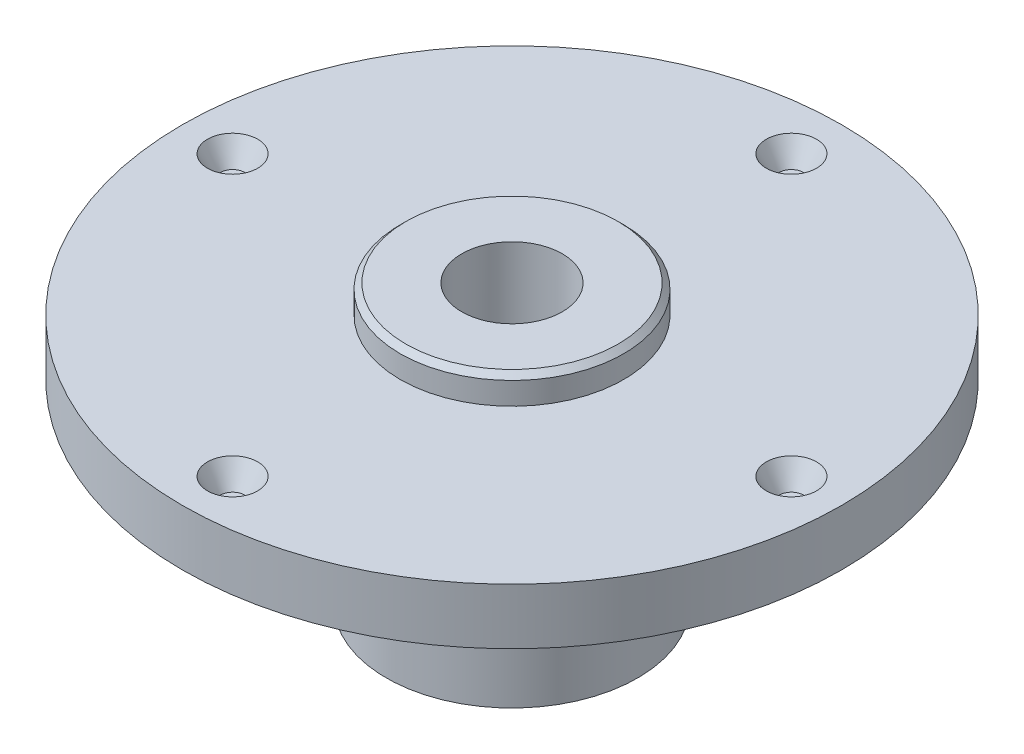
ISO-10303-21;
HEADER;
FILE_DESCRIPTION(('STEP AP214'),'2;1');
FILE_NAME('part.step','',(''),(''),'','','');
FILE_SCHEMA(('AUTOMOTIVE_DESIGN { 1 0 10303 214 1 1 1 1 }'));
ENDSEC;
DATA;
#1=APPLICATION_CONTEXT('core data for automotive mechanical design processes');
#2=APPLICATION_PROTOCOL_DEFINITION('international standard','automotive_design',2000,#1);
#3=PRODUCT_CONTEXT('',#1,'mechanical');
#4=PRODUCT('Part','Part','',(#3));
#5=PRODUCT_RELATED_PRODUCT_CATEGORY('part','',(#4));
#6=PRODUCT_DEFINITION_FORMATION('','',#4);
#7=PRODUCT_DEFINITION_CONTEXT('part definition',#1,'design');
#8=PRODUCT_DEFINITION('design','',#6,#7);
#9=PRODUCT_DEFINITION_SHAPE('','',#8);
#10=(LENGTH_UNIT() NAMED_UNIT(*) SI_UNIT(.MILLI.,.METRE.));
#11=(NAMED_UNIT(*) PLANE_ANGLE_UNIT() SI_UNIT($,.RADIAN.));
#12=(NAMED_UNIT(*) SI_UNIT($,.STERADIAN.) SOLID_ANGLE_UNIT());
#13=UNCERTAINTY_MEASURE_WITH_UNIT(LENGTH_MEASURE(1.E-05),#10,'distance_accuracy_value','');
#14=(GEOMETRIC_REPRESENTATION_CONTEXT(3) GLOBAL_UNCERTAINTY_ASSIGNED_CONTEXT((#13)) GLOBAL_UNIT_ASSIGNED_CONTEXT((#10,
#11,#12)) REPRESENTATION_CONTEXT('',''));
#15=CARTESIAN_POINT('',(0.,0.,0.));
#16=DIRECTION('',(0.,0.,1.));
#17=DIRECTION('',(1.,0.,0.));
#18=AXIS2_PLACEMENT_3D('',#15,#16,#17);
#19=CARTESIAN_POINT('',(0.,0.,0.));
#20=DIRECTION('',(0.,-1.,0.));
#21=DIRECTION('',(0.,0.,-1.));
#22=AXIS2_PLACEMENT_3D('',#19,#20,#21);
#23=CYLINDRICAL_SURFACE('',#22,9.);
#24=CARTESIAN_POINT('',(-8.64580823289529,15.,-2.5));
#25=CARTESIAN_POINT('',(-8.64581037496086,15.1374869532899,-2.49999714996617));
#26=CARTESIAN_POINT('',(-8.64912360937159,15.2750032400731,-2.48861977425243));
#27=CARTESIAN_POINT('',(-8.66197474072458,15.5460485954312,-2.44350693717148));
#28=CARTESIAN_POINT('',(-8.67151541786231,15.6795758552777,-2.40976148964066));
#29=CARTESIAN_POINT('',(-8.69565935423007,15.9386823267595,-2.32112008680785));
#30=CARTESIAN_POINT('',(-8.71025507855494,16.0642730407537,-2.26625559744293));
#31=CARTESIAN_POINT('',(-8.74285475062133,16.3044909220554,-2.13703377417484));
#32=CARTESIAN_POINT('',(-8.76085904445197,16.4191169742854,-2.06267446056935));
#33=CARTESIAN_POINT('',(-8.79879482245345,16.6372618555828,-1.89441531907552));
#34=CARTESIAN_POINT('',(-8.81876275539878,16.7404391176362,-1.80008077870937));
#35=CARTESIAN_POINT('',(-8.85806239814546,16.9297308390393,-1.59548286960028));
#36=CARTESIAN_POINT('',(-8.87739403696071,17.015843399965,-1.48521773095722));
#37=CARTESIAN_POINT('',(-8.91365202741973,17.1700044611612,-1.249500428906));
#38=CARTESIAN_POINT('',(-8.93053038427289,17.2377105918444,-1.12381632761083));
#39=CARTESIAN_POINT('',(-8.95956018312964,17.3508992737597,-0.862300362049424));
#40=CARTESIAN_POINT('',(-8.97171249276934,17.396385904574,-0.726470365890892));
#41=CARTESIAN_POINT('',(-8.98966318340413,17.4627309454726,-0.452086360205861));
#42=CARTESIAN_POINT('',(-8.99561138050702,17.4841710422613,-0.313682975067016));
#43=CARTESIAN_POINT('',(-9.00100867384281,17.503647456656,-0.0351244568787281));
#44=CARTESIAN_POINT('',(-9.00045894674934,17.5016880115567,0.105030354422776));
#45=CARTESIAN_POINT('',(-8.99303086374215,17.4748244476162,0.379054247152544));
#46=CARTESIAN_POINT('',(-8.9863259807526,17.4505492360309,0.512990410045097));
#47=CARTESIAN_POINT('',(-8.96754760099033,17.3807628617674,0.77480748332248));
#48=CARTESIAN_POINT('',(-8.95547378574645,17.3352504393449,0.902688034006089));
#49=CARTESIAN_POINT('',(-8.92706250606229,17.2238179194169,1.15033359179948));
#50=CARTESIAN_POINT('',(-8.91068150784286,17.1576880904757,1.26999902658788));
#51=CARTESIAN_POINT('',(-8.87541221350138,17.0070603841802,1.49674457308826));
#52=CARTESIAN_POINT('',(-8.85652339359456,16.922558667308,1.60382204684013));
#53=CARTESIAN_POINT('',(-8.81753663226074,16.7342713422228,1.8061067603823));
#54=CARTESIAN_POINT('',(-8.79741936953618,16.6299381943543,1.9008012505898));
#55=CARTESIAN_POINT('',(-8.75880383152746,16.4066673248778,2.07148108085113));
#56=CARTESIAN_POINT('',(-8.74030567318146,16.2877285498816,2.14746507027557));
#57=CARTESIAN_POINT('',(-8.70694013940655,16.0374352785877,2.27900238121953));
#58=CARTESIAN_POINT('',(-8.69209980055975,15.9059977306941,2.33440501640979));
#59=CARTESIAN_POINT('',(-8.66806022503139,15.6351564042415,2.42215297643582));
#60=CARTESIAN_POINT('',(-8.65885945119346,15.4957548077501,2.45450458459976));
#61=CARTESIAN_POINT('',(-8.64747148287152,15.2177654860021,2.49432455486229));
#62=CARTESIAN_POINT('',(-8.6450674615786,15.079296765191,2.50256249342185));
#63=CARTESIAN_POINT('',(-8.64694988564764,14.8029580095482,2.49605092061448));
#64=CARTESIAN_POINT('',(-8.65123554925281,14.6650879066499,2.48130409524808));
#65=CARTESIAN_POINT('',(-8.66580389953324,14.3969022533087,2.42992241428478));
#66=CARTESIAN_POINT('',(-8.6759568683615,14.2664883311528,2.39376059864355));
#67=CARTESIAN_POINT('',(-8.70098664146816,14.0135797728991,2.30111259188306));
#68=CARTESIAN_POINT('',(-8.71586410048919,13.8910862372804,2.24462358357885));
#69=CARTESIAN_POINT('',(-8.74910362417902,13.6543046314422,2.11139571215837));
#70=CARTESIAN_POINT('',(-8.767539598555,13.5402782289618,2.03421067264884));
#71=CARTESIAN_POINT('',(-8.80564999409987,13.3265137559243,1.86232721847475));
#72=CARTESIAN_POINT('',(-8.82532466803799,13.2267786153355,1.76762522160664));
#73=CARTESIAN_POINT('',(-8.86445019939347,13.0411785294316,1.55981743646719));
#74=CARTESIAN_POINT('',(-8.88387421295946,12.9558531899322,1.44622359870981));
#75=CARTESIAN_POINT('',(-8.91967402878593,12.8054760289225,1.20588311286949));
#76=CARTESIAN_POINT('',(-8.93604999253946,12.7404231332058,1.07913716217184));
#77=CARTESIAN_POINT('',(-8.96380327787492,12.6330504081766,0.816978395233259));
#78=CARTESIAN_POINT('',(-8.97521823979382,12.5905588339328,0.681640101050669));
#79=CARTESIAN_POINT('',(-8.99192942838897,12.5290318265592,0.405376312895358));
#80=CARTESIAN_POINT('',(-8.99722713582853,12.5099907168564,0.264452179596268));
#81=CARTESIAN_POINT('',(-9.00103042209332,12.4962856703137,-0.0139601523576443));
#82=CARTESIAN_POINT('',(-8.99975568986336,12.5008332929093,-0.151407064589647));
#83=CARTESIAN_POINT('',(-8.99106088846503,12.5323285624906,-0.423500619727716));
#84=CARTESIAN_POINT('',(-8.98364108593445,12.55927523757,-0.55814738387381));
#85=CARTESIAN_POINT('',(-8.96353984091204,12.6343432236282,-0.819784983469303));
#86=CARTESIAN_POINT('',(-8.95090116936265,12.6822925979333,-0.946828656281136));
#87=CARTESIAN_POINT('',(-8.9216782029765,12.7978519382311,-1.19113920788314));
#88=CARTESIAN_POINT('',(-8.90509332036378,12.8654648333786,-1.30840462671538));
#89=CARTESIAN_POINT('',(-8.86915397347007,13.0206719427157,-1.53345112172909));
#90=CARTESIAN_POINT('',(-8.84973411731035,13.1087800860686,-1.64086726646983));
#91=CARTESIAN_POINT('',(-8.81055920809079,13.3015179304515,-1.83965563573724));
#92=CARTESIAN_POINT('',(-8.79080406570366,13.4061520980475,-1.931023508681));
#93=CARTESIAN_POINT('',(-8.75263553519991,13.6320445174442,-2.09734241907801));
#94=CARTESIAN_POINT('',(-8.73426670491593,13.7536463895319,-2.17183796747973));
#95=CARTESIAN_POINT('',(-8.70160385709124,14.0081439871787,-2.29922652645139));
#96=CARTESIAN_POINT('',(-8.68730739437858,14.1410328731802,-2.35213250833712));
#97=CARTESIAN_POINT('',(-8.66621345779749,14.3943601297383,-2.42859494882475));
#98=CARTESIAN_POINT('',(-8.65862660680177,14.5137894055564,-2.45530563406018));
#99=CARTESIAN_POINT('',(-8.64842338463344,14.7554716482243,-2.49100820491655));
#100=CARTESIAN_POINT('',(-8.64580632782193,14.8777242232124,-2.50000253471396));
#101=CARTESIAN_POINT('',(-8.64580823289529,15.,-2.5));
#102=B_SPLINE_CURVE_WITH_KNOTS('',3,(#24,#25,#26,#27,#28,#29,#30,#31,#32,#33,#34,#35,#36,#37,
#38,#39,#40,#41,#42,#43,#44,#45,#46,#47,#48,#49,#50,#51,#52,#53,#54,#55,#56,#57,#58,#59,#60,#61,
#62,#63,#64,#65,#66,#67,#68,#69,#70,#71,#72,#73,#74,#75,#76,#77,#78,#79,#80,#81,#82,#83,#84,#85,
#86,#87,#88,#89,#90,#91,#92,#93,#94,#95,#96,#97,#98,#99,#100,#101),.UNSPECIFIED.,.T.,.F.,(4,2,2,
2,2,2,2,2,2,2,2,2,2,2,2,2,2,2,2,2,2,2,2,2,2,2,2,2,2,2,2,2,2,2,2,2,2,2,4),(0.,0.412010791688958,
0.824205648454514,1.23578872527857,1.64741361462616,2.0691389576003,2.49091119062405,
2.92006196750631,3.34913392107923,3.7675863122474,4.18596292931721,4.59289867518082,
4.99985856264056,5.4111013330343,5.82243013129567,6.24742875551483,6.67245804954201,
7.10054057407685,7.5285063657189,7.94265637768505,8.35675799569095,8.76203677700911,
9.16737174834454,9.58226667645632,9.99724654423657,10.4253750626708,10.8534808913584,
11.2782793253857,11.7029749096957,12.1135686473819,12.5241445701257,12.9314203987337,
13.3387569278366,13.7576868945778,14.1767302818544,14.6060087946726,15.0350290098245,
15.4015066296816,15.7679336861631),.UNSPECIFIED.);
#103=CARTESIAN_POINT('',(-8.64580823289529,15.,-2.5));
#104=VERTEX_POINT('',#103);
#105=EDGE_CURVE('E79',#104,#104,#102,.T.);
#106=ORIENTED_EDGE('',*,*,#105,.F.);
#107=EDGE_LOOP('',(#106));
#108=FACE_BOUND('',#107,.T.);
#109=CARTESIAN_POINT('',(8.64580823289528,15.,-2.5));
#110=CARTESIAN_POINT('',(8.64581037496085,14.8625130467101,-2.49999714996617));
#111=CARTESIAN_POINT('',(8.64912360937159,14.7249967599269,-2.48861977425243));
#112=CARTESIAN_POINT('',(8.66197474072459,14.4539514045688,-2.44350693717148));
#113=CARTESIAN_POINT('',(8.67151541786231,14.3204241447223,-2.40976148964066));
#114=CARTESIAN_POINT('',(8.69565935423007,14.0613176732405,-2.32112008680785));
#115=CARTESIAN_POINT('',(8.71025507855494,13.9357269592463,-2.26625559744293));
#116=CARTESIAN_POINT('',(8.74285475062133,13.6955090779446,-2.13703377417485));
#117=CARTESIAN_POINT('',(8.76085904445197,13.5808830257146,-2.06267446056936));
#118=CARTESIAN_POINT('',(8.79879482245345,13.3627381444172,-1.89441531907553));
#119=CARTESIAN_POINT('',(8.81876275539878,13.2595608823638,-1.80008077870937));
#120=CARTESIAN_POINT('',(8.85806239814546,13.0702691609607,-1.59548286960028));
#121=CARTESIAN_POINT('',(8.87739403696071,12.984156600035,-1.48521773095723));
#122=CARTESIAN_POINT('',(8.91365202741973,12.8299955388388,-1.249500428906));
#123=CARTESIAN_POINT('',(8.93053038427288,12.7622894081556,-1.12381632761084));
#124=CARTESIAN_POINT('',(8.95956018312964,12.6491007262403,-0.862300362049429));
#125=CARTESIAN_POINT('',(8.97171249276934,12.603614095426,-0.726470365890897));
#126=CARTESIAN_POINT('',(8.98966318340413,12.5372690545274,-0.452086360205866));
#127=CARTESIAN_POINT('',(8.99561138050702,12.5158289577387,-0.31368297506702));
#128=CARTESIAN_POINT('',(9.00100867384281,12.496352543344,-0.0351244568787312));
#129=CARTESIAN_POINT('',(9.00045894674934,12.4983119884433,0.105030354422774));
#130=CARTESIAN_POINT('',(8.99303086374216,12.5251755523838,0.379054247152542));
#131=CARTESIAN_POINT('',(8.9863259807526,12.5494507639691,0.512990410045096));
#132=CARTESIAN_POINT('',(8.96754760099033,12.6192371382325,0.774807483322479));
#133=CARTESIAN_POINT('',(8.95547378574645,12.6647495606551,0.902688034006088));
#134=CARTESIAN_POINT('',(8.92706250606229,12.7761820805831,1.15033359179948));
#135=CARTESIAN_POINT('',(8.91068150784286,12.8423119095243,1.26999902658788));
#136=CARTESIAN_POINT('',(8.87541221350138,12.9929396158198,1.49674457308826));
#137=CARTESIAN_POINT('',(8.85652339359456,13.077441332692,1.60382204684013));
#138=CARTESIAN_POINT('',(8.81753663226074,13.2657286577772,1.8061067603823));
#139=CARTESIAN_POINT('',(8.79741936953618,13.3700618056457,1.9008012505898));
#140=CARTESIAN_POINT('',(8.75880383152746,13.5933326751222,2.07148108085113));
#141=CARTESIAN_POINT('',(8.74030567318146,13.7122714501184,2.14746507027557));
#142=CARTESIAN_POINT('',(8.70694013940655,13.9625647214123,2.27900238121953));
#143=CARTESIAN_POINT('',(8.69209980055974,14.0940022693059,2.33440501640979));
#144=CARTESIAN_POINT('',(8.66806022503139,14.3648435957585,2.42215297643582));
#145=CARTESIAN_POINT('',(8.65885945119346,14.5042451922499,2.45450458459976));
#146=CARTESIAN_POINT('',(8.64747148287153,14.7822345139979,2.49432455486229));
#147=CARTESIAN_POINT('',(8.6450674615786,14.920703234809,2.50256249342185));
#148=CARTESIAN_POINT('',(8.64694988564764,15.1970419904518,2.49605092061448));
#149=CARTESIAN_POINT('',(8.65123554925281,15.3349120933501,2.48130409524808));
#150=CARTESIAN_POINT('',(8.66580389953324,15.6030977466913,2.42992241428478));
#151=CARTESIAN_POINT('',(8.6759568683615,15.7335116688472,2.39376059864355));
#152=CARTESIAN_POINT('',(8.70098664146816,15.9864202271009,2.30111259188306));
#153=CARTESIAN_POINT('',(8.71586410048919,16.1089137627196,2.24462358357885));
#154=CARTESIAN_POINT('',(8.74910362417902,16.3456953685578,2.11139571215837));
#155=CARTESIAN_POINT('',(8.76753959855501,16.4597217710382,2.03421067264883));
#156=CARTESIAN_POINT('',(8.80564999409988,16.6734862440757,1.86232721847475));
#157=CARTESIAN_POINT('',(8.82532466803799,16.7732213846645,1.76762522160664));
#158=CARTESIAN_POINT('',(8.86445019939347,16.9588214705684,1.5598174364672));
#159=CARTESIAN_POINT('',(8.88387421295946,17.0441468100678,1.44622359870981));
#160=CARTESIAN_POINT('',(8.91967402878593,17.1945239710775,1.20588311286949));
#161=CARTESIAN_POINT('',(8.93604999253946,17.2595768667942,1.07913716217184));
#162=CARTESIAN_POINT('',(8.96380327787492,17.3669495918234,0.816978395233262));
#163=CARTESIAN_POINT('',(8.97521823979382,17.4094411660672,0.681640101050672));
#164=CARTESIAN_POINT('',(8.99192942838896,17.4709681734408,0.405376312895361));
#165=CARTESIAN_POINT('',(8.99722713582853,17.4900092831436,0.26445217959627));
#166=CARTESIAN_POINT('',(9.00103042209332,17.5037143296863,-0.0139601523576419));
#167=CARTESIAN_POINT('',(8.99975568986336,17.4991667070907,-0.151407064589645));
#168=CARTESIAN_POINT('',(8.99106088846503,17.4676714375094,-0.423500619727714));
#169=CARTESIAN_POINT('',(8.98364108593445,17.44072476243,-0.558147383873809));
#170=CARTESIAN_POINT('',(8.96353984091204,17.3656567763718,-0.819784983469302));
#171=CARTESIAN_POINT('',(8.95090116936265,17.3177074020667,-0.946828656281135));
#172=CARTESIAN_POINT('',(8.9216782029765,17.2021480617689,-1.19113920788314));
#173=CARTESIAN_POINT('',(8.90509332036378,17.1345351666214,-1.30840462671538));
#174=CARTESIAN_POINT('',(8.86915397347007,16.9793280572843,-1.53345112172909));
#175=CARTESIAN_POINT('',(8.84973411731035,16.8912199139314,-1.64086726646984));
#176=CARTESIAN_POINT('',(8.81055920809079,16.6984820695485,-1.83965563573724));
#177=CARTESIAN_POINT('',(8.79080406570366,16.5938479019525,-1.931023508681));
#178=CARTESIAN_POINT('',(8.75263553519991,16.3679554825558,-2.09734241907802));
#179=CARTESIAN_POINT('',(8.73426670491593,16.2463536104681,-2.17183796747973));
#180=CARTESIAN_POINT('',(8.70160385709124,15.9918560128213,-2.29922652645139));
#181=CARTESIAN_POINT('',(8.68730739437858,15.8589671268198,-2.35213250833712));
#182=CARTESIAN_POINT('',(8.66621345779749,15.6056398702617,-2.42859494882475));
#183=CARTESIAN_POINT('',(8.65862660680177,15.4862105944436,-2.45530563406018));
#184=CARTESIAN_POINT('',(8.64842338463344,15.2445283517757,-2.49100820491655));
#185=CARTESIAN_POINT('',(8.64580632782193,15.1222757767876,-2.50000253471396));
#186=CARTESIAN_POINT('',(8.64580823289528,15.,-2.5));
#187=B_SPLINE_CURVE_WITH_KNOTS('',3,(#109,#110,#111,#112,#113,#114,#115,#116,#117,#118,#119,
#120,#121,#122,#123,#124,#125,#126,#127,#128,#129,#130,#131,#132,#133,#134,#135,#136,#137,#138,
#139,#140,#141,#142,#143,#144,#145,#146,#147,#148,#149,#150,#151,#152,#153,#154,#155,#156,#157,
#158,#159,#160,#161,#162,#163,#164,#165,#166,#167,#168,#169,#170,#171,#172,#173,#174,#175,#176,
#177,#178,#179,#180,#181,#182,#183,#184,#185,#186),.UNSPECIFIED.,.T.,.F.,(4,2,2,2,2,2,2,2,2,2,2,
2,2,2,2,2,2,2,2,2,2,2,2,2,2,2,2,2,2,2,2,2,2,2,2,2,2,2,4),(0.,0.412010791688958,
0.824205648454514,1.23578872527857,1.64741361462616,2.0691389576003,2.49091119062405,
2.9200619675063,3.34913392107923,3.7675863122474,4.18596292931721,4.59289867518082,
4.99985856264056,5.41110133303431,5.82243013129568,6.24742875551483,6.67245804954201,
7.10054057407685,7.52850636571891,7.94265637768505,8.35675799569095,8.76203677700912,
9.16737174834455,9.58226667645632,9.99724654423657,10.4253750626708,10.8534808913584,
11.2782793253857,11.7029749096957,12.1135686473819,12.5241445701257,12.9314203987337,
13.3387569278366,13.7576868945778,14.1767302818544,14.6060087946727,15.0350290098245,
15.4015066296816,15.7679336861631),.UNSPECIFIED.);
#188=CARTESIAN_POINT('',(8.64580823289528,15.,-2.5));
#189=VERTEX_POINT('',#188);
#190=EDGE_CURVE('E75',#189,#189,#187,.T.);
#191=ORIENTED_EDGE('',*,*,#190,.F.);
#192=EDGE_LOOP('',(#191));
#193=FACE_BOUND('',#192,.T.);
#194=CARTESIAN_POINT('',(0.,0.,0.));
#195=DIRECTION('',(0.,-1.,0.));
#196=DIRECTION('',(0.,0.,-1.));
#197=AXIS2_PLACEMENT_3D('',#194,#195,#196);
#198=CIRCLE('',#197,8.99999999999999);
#199=CARTESIAN_POINT('',(0.,0.,-8.99999999999999));
#200=VERTEX_POINT('',#199);
#201=EDGE_CURVE('E108',#200,#200,#198,.T.);
#202=ORIENTED_EDGE('',*,*,#201,.T.);
#203=EDGE_LOOP('',(#202));
#204=FACE_BOUND('',#203,.T.);
#205=CARTESIAN_POINT('',(0.,50.,0.));
#206=DIRECTION('',(0.,-1.,0.));
#207=DIRECTION('',(0.,0.,-1.));
#208=AXIS2_PLACEMENT_3D('',#205,#206,#207);
#209=CIRCLE('',#208,9.);
#210=CARTESIAN_POINT('',(0.,50.,-9.));
#211=VERTEX_POINT('',#210);
#212=EDGE_CURVE('E125',#211,#211,#209,.T.);
#213=ORIENTED_EDGE('',*,*,#212,.F.);
#214=EDGE_LOOP('',(#213));
#215=FACE_BOUND('',#214,.T.);
#216=ADVANCED_FACE('F30',(#108,#193,#204,#215),#23,.F.);
#217=CARTESIAN_POINT('',(20.,50.,0.));
#218=DIRECTION('',(0.,1.,0.));
#219=DIRECTION('',(0.,0.,1.));
#220=AXIS2_PLACEMENT_3D('',#217,#218,#219);
#221=PLANE('',#220);
#222=CARTESIAN_POINT('',(0.,50.,0.));
#223=DIRECTION('',(0.,1.,0.));
#224=DIRECTION('',(0.,0.,1.));
#225=AXIS2_PLACEMENT_3D('',#222,#223,#224);
#226=CIRCLE('',#225,19.);
#227=CARTESIAN_POINT('',(0.,50.,19.));
#228=VERTEX_POINT('',#227);
#229=EDGE_CURVE('E10',#228,#228,#226,.T.);
#230=ORIENTED_EDGE('',*,*,#229,.T.);
#231=EDGE_LOOP('',(#230));
#232=FACE_BOUND('',#231,.T.);
#233=ORIENTED_EDGE('',*,*,#212,.T.);
#234=EDGE_LOOP('',(#233));
#235=FACE_BOUND('',#234,.T.);
#236=ADVANCED_FACE('F149',(#232,#235),#221,.T.);
#237=CARTESIAN_POINT('',(0.,0.,0.));
#238=DIRECTION('',(0.,-1.,0.));
#239=DIRECTION('',(0.,0.,-1.));
#240=AXIS2_PLACEMENT_3D('',#237,#238,#239);
#241=CYLINDRICAL_SURFACE('',#240,20.);
#242=CARTESIAN_POINT('',(0.,49.,0.));
#243=DIRECTION('',(0.,1.,0.));
#244=DIRECTION('',(0.,0.,1.));
#245=AXIS2_PLACEMENT_3D('',#242,#243,#244);
#246=CIRCLE('',#245,20.);
#247=CARTESIAN_POINT('',(0.,49.,20.));
#248=VERTEX_POINT('',#247);
#249=EDGE_CURVE('E37',#248,#248,#246,.F.);
#250=ORIENTED_EDGE('',*,*,#249,.T.);
#251=EDGE_LOOP('',(#250));
#252=FACE_BOUND('',#251,.T.);
#253=CARTESIAN_POINT('',(0.,45.,0.));
#254=DIRECTION('',(0.,-1.,0.));
#255=DIRECTION('',(0.,0.,-1.));
#256=AXIS2_PLACEMENT_3D('',#253,#254,#255);
#257=CIRCLE('',#256,20.);
#258=CARTESIAN_POINT('',(0.,45.,-20.));
#259=VERTEX_POINT('',#258);
#260=EDGE_CURVE('E123',#259,#259,#257,.T.);
#261=ORIENTED_EDGE('',*,*,#260,.F.);
#262=EDGE_LOOP('',(#261));
#263=FACE_BOUND('',#262,.T.);
#264=ADVANCED_FACE('F154',(#252,#263),#241,.T.);
#265=CARTESIAN_POINT('',(59.,45.,0.));
#266=DIRECTION('',(0.,1.,0.));
#267=DIRECTION('',(0.,0.,1.));
#268=AXIS2_PLACEMENT_3D('',#265,#266,#267);
#269=PLANE('',#268);
#270=CARTESIAN_POINT('',(5.23722504166407E-13,45.,50.));
#271=DIRECTION('',(0.,1.,0.));
#272=DIRECTION('',(-1.,0.,0.));
#273=AXIS2_PLACEMENT_3D('',#270,#271,#272);
#274=CIRCLE('',#273,4.5);
#275=CARTESIAN_POINT('',(-4.49999999999947,45.,50.));
#276=VERTEX_POINT('',#275);
#277=EDGE_CURVE('E84',#276,#276,#274,.T.);
#278=ORIENTED_EDGE('',*,*,#277,.F.);
#279=EDGE_LOOP('',(#278));
#280=FACE_BOUND('',#279,.T.);
#281=CARTESIAN_POINT('',(-50.,45.,3.49148336110938E-13));
#282=DIRECTION('',(0.,1.,0.));
#283=DIRECTION('',(0.,0.,-1.));
#284=AXIS2_PLACEMENT_3D('',#281,#282,#283);
#285=CIRCLE('',#284,4.5);
#286=CARTESIAN_POINT('',(-50.,45.,-4.49999999999965));
#287=VERTEX_POINT('',#286);
#288=EDGE_CURVE('E90',#287,#287,#285,.T.);
#289=ORIENTED_EDGE('',*,*,#288,.F.);
#290=EDGE_LOOP('',(#289));
#291=FACE_BOUND('',#290,.T.);
#292=CARTESIAN_POINT('',(-1.74574168055469E-13,45.,-50.));
#293=DIRECTION('',(0.,1.,0.));
#294=DIRECTION('',(1.,0.,0.));
#295=AXIS2_PLACEMENT_3D('',#292,#293,#294);
#296=CIRCLE('',#295,4.5);
#297=CARTESIAN_POINT('',(4.49999999999982,45.,-50.));
#298=VERTEX_POINT('',#297);
#299=EDGE_CURVE('E96',#298,#298,#296,.T.);
#300=ORIENTED_EDGE('',*,*,#299,.F.);
#301=EDGE_LOOP('',(#300));
#302=FACE_BOUND('',#301,.T.);
#303=CARTESIAN_POINT('',(50.,45.,0.));
#304=DIRECTION('',(0.,1.,0.));
#305=DIRECTION('',(0.,0.,1.));
#306=AXIS2_PLACEMENT_3D('',#303,#304,#305);
#307=CIRCLE('',#306,4.5);
#308=CARTESIAN_POINT('',(50.,45.,4.5));
#309=VERTEX_POINT('',#308);
#310=EDGE_CURVE('E102',#309,#309,#307,.T.);
#311=ORIENTED_EDGE('',*,*,#310,.F.);
#312=EDGE_LOOP('',(#311));
#313=FACE_BOUND('',#312,.T.);
#314=ORIENTED_EDGE('',*,*,#260,.T.);
#315=EDGE_LOOP('',(#314));
#316=FACE_BOUND('',#315,.T.);
#317=CARTESIAN_POINT('',(0.,45.,0.));
#318=DIRECTION('',(0.,-1.,0.));
#319=DIRECTION('',(0.,0.,-1.));
#320=AXIS2_PLACEMENT_3D('',#317,#318,#319);
#321=CIRCLE('',#320,59.);
#322=CARTESIAN_POINT('',(0.,45.,-59.));
#323=VERTEX_POINT('',#322);
#324=EDGE_CURVE('E120',#323,#323,#321,.T.);
#325=ORIENTED_EDGE('',*,*,#324,.F.);
#326=EDGE_LOOP('',(#325));
#327=FACE_BOUND('',#326,.T.);
#328=ADVANCED_FACE('F179',(#280,#291,#302,#313,#316,#327),#269,.T.);
#329=CARTESIAN_POINT('',(0.,0.,0.));
#330=DIRECTION('',(0.,-1.,0.));
#331=DIRECTION('',(0.,0.,-1.));
#332=AXIS2_PLACEMENT_3D('',#329,#330,#331);
#333=CYLINDRICAL_SURFACE('',#332,59.);
#334=ORIENTED_EDGE('',*,*,#324,.T.);
#335=EDGE_LOOP('',(#334));
#336=FACE_BOUND('',#335,.T.);
#337=CARTESIAN_POINT('',(0.,35.,0.));
#338=DIRECTION('',(0.,-1.,0.));
#339=DIRECTION('',(0.,0.,-1.));
#340=AXIS2_PLACEMENT_3D('',#337,#338,#339);
#341=CIRCLE('',#340,59.);
#342=CARTESIAN_POINT('',(0.,35.,-59.));
#343=VERTEX_POINT('',#342);
#344=EDGE_CURVE('E117',#343,#343,#341,.T.);
#345=ORIENTED_EDGE('',*,*,#344,.F.);
#346=EDGE_LOOP('',(#345));
#347=FACE_BOUND('',#346,.T.);
#348=ADVANCED_FACE('F275',(#336,#347),#333,.T.);
#349=CARTESIAN_POINT('',(22.5,35.,0.));
#350=DIRECTION('',(0.,-1.,0.));
#351=DIRECTION('',(0.,0.,-1.));
#352=AXIS2_PLACEMENT_3D('',#349,#350,#351);
#353=PLANE('',#352);
#354=ORIENTED_EDGE('',*,*,#344,.T.);
#355=EDGE_LOOP('',(#354));
#356=FACE_BOUND('',#355,.T.);
#357=CARTESIAN_POINT('',(0.,35.,0.));
#358=DIRECTION('',(0.,-1.,0.));
#359=DIRECTION('',(0.,0.,-1.));
#360=AXIS2_PLACEMENT_3D('',#357,#358,#359);
#361=CIRCLE('',#360,22.5);
#362=CARTESIAN_POINT('',(0.,35.,-22.5));
#363=VERTEX_POINT('',#362);
#364=EDGE_CURVE('E114',#363,#363,#361,.T.);
#365=ORIENTED_EDGE('',*,*,#364,.F.);
#366=EDGE_LOOP('',(#365));
#367=FACE_BOUND('',#366,.T.);
#368=ADVANCED_FACE('F136',(#356,#367),#353,.T.);
#369=CARTESIAN_POINT('',(0.,0.,0.));
#370=DIRECTION('',(0.,-1.,0.));
#371=DIRECTION('',(0.,0.,-1.));
#372=AXIS2_PLACEMENT_3D('',#369,#370,#371);
#373=CYLINDRICAL_SURFACE('',#372,22.5);
#374=CARTESIAN_POINT('',(-22.5,12.5,0.));
#375=CARTESIAN_POINT('',(-22.4999982319295,12.5000060160341,0.139963290436899));
#376=CARTESIAN_POINT('',(-22.498680176381,12.5117934313811,0.280017003711888));
#377=CARTESIAN_POINT('',(-22.4935489494524,12.5586344105302,0.556235592308378));
#378=CARTESIAN_POINT('',(-22.4897330890894,12.5937130488135,0.692396111397233));
#379=CARTESIAN_POINT('',(-22.4800366342404,12.6860974439777,0.956788848837864));
#380=CARTESIAN_POINT('',(-22.4741573468395,12.7433891323246,1.08502602592204));
#381=CARTESIAN_POINT('',(-22.4609899763586,12.8785445177482,1.33003816262482));
#382=CARTESIAN_POINT('',(-22.4537021573586,12.9564043595864,1.44681526466862));
#383=CARTESIAN_POINT('',(-22.438497147732,13.1308525626602,1.66613219683783));
#384=CARTESIAN_POINT('',(-22.4305776039205,13.227513081071,1.76861447442762));
#385=CARTESIAN_POINT('',(-22.4150209790671,13.4366643450456,1.95593754637563));
#386=CARTESIAN_POINT('',(-22.4073839116411,13.5491558524482,2.04077749124032));
#387=CARTESIAN_POINT('',(-22.3932333493671,13.7871424102878,2.19061627270288));
#388=CARTESIAN_POINT('',(-22.3867228707193,13.9126709713123,2.25556219427924));
#389=CARTESIAN_POINT('',(-22.3755927254414,14.1729368258588,2.36343147250995));
#390=CARTESIAN_POINT('',(-22.37097300175,14.307673841335,2.4063554937747));
#391=CARTESIAN_POINT('',(-22.3641693028941,14.5819399973304,2.46878993115805));
#392=CARTESIAN_POINT('',(-22.3619753146837,14.7214469688387,2.48839662302772));
#393=CARTESIAN_POINT('',(-22.3602406332654,15.0017873272876,2.50393757504383));
#394=CARTESIAN_POINT('',(-22.3606998549449,15.1426206715347,2.49987259455604));
#395=CARTESIAN_POINT('',(-22.3642105512675,15.4209493437145,2.46826480534876));
#396=CARTESIAN_POINT('',(-22.3672503765387,15.5584568208432,2.44082750216216));
#397=CARTESIAN_POINT('',(-22.3755615896676,15.8269032817359,2.36341826447111));
#398=CARTESIAN_POINT('',(-22.3808330140012,15.9578421580957,2.3134459616269));
#399=CARTESIAN_POINT('',(-22.3930268031298,16.2097655289539,2.19227007599314));
#400=CARTESIAN_POINT('',(-22.3999527698502,16.3307275200198,2.1210200860185));
#401=CARTESIAN_POINT('',(-22.4146723403989,16.5590170634136,1.95934463329594));
#402=CARTESIAN_POINT('',(-22.4224659755941,16.6663441225292,1.86891847720992));
#403=CARTESIAN_POINT('',(-22.4380946122411,16.8649299803858,1.67087018617446));
#404=CARTESIAN_POINT('',(-22.4459296076163,16.9560980065309,1.56315700708533));
#405=CARTESIAN_POINT('',(-22.4607182137728,17.1190729770904,1.33390727495122));
#406=CARTESIAN_POINT('',(-22.4676718231792,17.1908798913072,1.21237070034629));
#407=CARTESIAN_POINT('',(-22.479917262824,17.313092205956,0.95885829441938));
#408=CARTESIAN_POINT('',(-22.4852087004631,17.3634925512188,0.826880006002129));
#409=CARTESIAN_POINT('',(-22.4935298062661,17.4413922188021,0.5562621945492));
#410=CARTESIAN_POINT('',(-22.4965595579937,17.4688923872329,0.417622917822384));
#411=CARTESIAN_POINT('',(-22.5000051383195,17.5000948771469,0.138404164867835));
#412=CARTESIAN_POINT('',(-22.5004347150112,17.5039223672453,-0.00216116111361714));
#413=CARTESIAN_POINT('',(-22.4986685150537,17.4880002593587,-0.281931235858953));
#414=CARTESIAN_POINT('',(-22.4964727823619,17.4682510561339,-0.421136007364151));
#415=CARTESIAN_POINT('',(-22.4897113666314,17.4058400744302,-0.693868824279165));
#416=CARTESIAN_POINT('',(-22.4851517930728,17.3632373523532,-0.827410548202295));
#417=CARTESIAN_POINT('',(-22.4741737542704,17.2563896528399,-1.08545283765862));
#418=CARTESIAN_POINT('',(-22.4677552382251,17.1921440839362,-1.20995315599037));
#419=CARTESIAN_POINT('',(-22.4537419625284,17.0435271361613,-1.44694158139682));
#420=CARTESIAN_POINT('',(-22.4461424725451,16.9590740488252,-1.55937816423878));
#421=CARTESIAN_POINT('',(-22.4306339481796,16.772555877082,-1.76852479350274));
#422=CARTESIAN_POINT('',(-22.4227249041675,16.6704902444346,-1.86523435019447));
#423=CARTESIAN_POINT('',(-22.407446855045,16.4510958886674,-2.0406202804102));
#424=CARTESIAN_POINT('',(-22.4000804205337,16.3337010119021,-2.11921415672401));
#425=CARTESIAN_POINT('',(-22.3867621609139,16.0873046456345,-2.2555694500626));
#426=CARTESIAN_POINT('',(-22.3808103126056,15.9583033465301,-2.31333120875094));
#427=CARTESIAN_POINT('',(-22.3710118528331,15.6926319266042,-2.40624640126429));
#428=CARTESIAN_POINT('',(-22.3671607735444,15.5559787678155,-2.4414478435141));
#429=CARTESIAN_POINT('',(-22.361986494682,15.278656065323,-2.48839847208497));
#430=CARTESIAN_POINT('',(-22.3606632039622,15.1379866666207,-2.50014850400818));
#431=CARTESIAN_POINT('',(-22.3606965730832,14.8574448061687,-2.49984946677098));
#432=CARTESIAN_POINT('',(-22.3620386401109,14.7175721866488,-2.48792998803822));
#433=CARTESIAN_POINT('',(-22.3672202869634,14.441830327093,-2.440903126006));
#434=CARTESIAN_POINT('',(-22.3710598686458,14.3059610900349,-2.40579572545892));
#435=CARTESIAN_POINT('',(-22.3807996813889,14.0420906118635,-2.31342739078205));
#436=CARTESIAN_POINT('',(-22.3866994619816,13.9140876579557,-2.25617129922743));
#437=CARTESIAN_POINT('',(-22.3998957650258,13.6694868831899,-2.12114385984066));
#438=CARTESIAN_POINT('',(-22.4071922903172,13.5528890855213,-2.04337247029699));
#439=CARTESIAN_POINT('',(-22.4224078492528,13.333744692342,-1.86903744067134));
#440=CARTESIAN_POINT('',(-22.4303299544675,13.2312752056551,-1.77237713625398));
#441=CARTESIAN_POINT('',(-22.4458763267716,13.0439576597365,-1.56320524060516));
#442=CARTESIAN_POINT('',(-22.45350052257,12.959113797676,-1.45068988450814));
#443=CARTESIAN_POINT('',(-22.4676169012086,12.8092445870623,-1.21261810846859));
#444=CARTESIAN_POINT('',(-22.4741055698385,12.7442803128363,-1.08702305802012));
#445=CARTESIAN_POINT('',(-22.4851829429196,12.636453134444,-0.826710618951539));
#446=CARTESIAN_POINT('',(-22.4897737561695,12.5935656865823,-0.692003549930551));
#447=CARTESIAN_POINT('',(-22.4954040690738,12.5416260481678,-0.463800299140748));
#448=CARTESIAN_POINT('',(-22.4971193575046,12.526038064451,-0.371755168576703));
#449=CARTESIAN_POINT('',(-22.499417908987,12.50522306392,-0.186486737378384));
#450=CARTESIAN_POINT('',(-22.50000117814,12.4999959912628,-0.0932634430968837));
#451=CARTESIAN_POINT('',(-22.5,12.5,0.));
#452=B_SPLINE_CURVE_WITH_KNOTS('',3,(#374,#375,#376,#377,#378,#379,#380,#381,#382,#383,#384,
#385,#386,#387,#388,#389,#390,#391,#392,#393,#394,#395,#396,#397,#398,#399,#400,#401,#402,#403,
#404,#405,#406,#407,#408,#409,#410,#411,#412,#413,#414,#415,#416,#417,#418,#419,#420,#421,#422,
#423,#424,#425,#426,#427,#428,#429,#430,#431,#432,#433,#434,#435,#436,#437,#438,#439,#440,#441,
#442,#443,#444,#445,#446,#447,#448,#449,#450,#451),.UNSPECIFIED.,.T.,.F.,(4,2,2,2,2,2,2,2,2,2,2,
2,2,2,2,2,2,2,2,2,2,2,2,2,2,2,2,2,2,2,2,2,2,2,2,2,2,2,4),(0.,0.419549267838509,
0.839550941048735,1.25928704150093,1.67894452352149,2.10024562230457,2.5215670024037,
2.94399949132785,3.36641923069172,3.78708870275308,4.20774468019391,4.62651176678918,
5.04528569847731,5.46497974166265,5.88468896199524,6.30668590666613,6.728683509522,
7.15078071193261,7.57286231810132,7.99271025838009,8.4125511689665,8.83131234699257,
9.25008497007837,9.67058038609555,10.0910888935848,10.5134761069732,10.9358563925552,
11.3573348406517,11.7787980909618,12.1979601942483,12.6171226093159,13.0361934307407,
13.4552651042228,13.8765403683299,14.2979158355662,14.7205731535823,15.1427595660995,
15.4223244437306,15.7018878145635),.UNSPECIFIED.);
#453=CARTESIAN_POINT('',(-22.5,12.5,0.));
#454=VERTEX_POINT('',#453);
#455=EDGE_CURVE('E41',#454,#454,#452,.T.);
#456=ORIENTED_EDGE('',*,*,#455,.F.);
#457=EDGE_LOOP('',(#456));
#458=FACE_BOUND('',#457,.T.);
#459=CARTESIAN_POINT('',(22.3606797749979,15.,-2.5));
#460=CARTESIAN_POINT('',(22.3606815839575,15.1399602836989,-2.49999398129401));
#461=CARTESIAN_POINT('',(22.3620080093187,15.2800109994313,-2.48820705527752));
#462=CARTESIAN_POINT('',(22.3671691325765,15.5562233601612,-2.44136819641235));
#463=CARTESIAN_POINT('',(22.3710065348961,15.6923806465658,-2.40629117859882));
#464=CARTESIAN_POINT('',(22.3807497040146,15.9567665475561,-2.3139115235387));
#465=CARTESIAN_POINT('',(22.3866541541713,16.0850001482441,-2.25662303178846));
#466=CARTESIAN_POINT('',(22.3998645328633,16.3300062891182,-2.12147517481489));
#467=CARTESIAN_POINT('',(22.4071701992065,16.4467809673007,-2.04361965701727));
#468=CARTESIAN_POINT('',(22.4223962880797,16.6661006227262,-1.86917582764954));
#469=CARTESIAN_POINT('',(22.4303190354834,16.7685872829477,-1.77251439232509));
#470=CARTESIAN_POINT('',(22.4458655806918,16.9559188173834,-1.56335945251558));
#471=CARTESIAN_POINT('',(22.4534893643154,17.0407628555528,-1.45086519817177));
#472=CARTESIAN_POINT('',(22.4676023592828,17.1906059282545,-1.21287621988859));
#473=CARTESIAN_POINT('',(22.4740885694516,17.255552796542,-1.08734845782744));
#474=CARTESIAN_POINT('',(22.4851701774412,17.3634240452486,-0.827084339397497));
#475=CARTESIAN_POINT('',(22.4897656313695,17.4063490791641,-0.692348256419468));
#476=CARTESIAN_POINT('',(22.4965315974815,17.4687856165272,-0.418085010777373));
#477=CARTESIAN_POINT('',(22.498712088116,17.4883934897354,-0.278580036949135));
#478=CARTESIAN_POINT('',(22.500436444692,17.5039374966287,0.00175640598188621));
#479=CARTESIAN_POINT('',(22.4999803937763,17.4998743767734,0.142587833115427));
#480=CARTESIAN_POINT('',(22.4964911785185,17.4682695440224,0.420924682349462));
#481=CARTESIAN_POINT('',(22.4934693894957,17.4408314633103,0.55844203434225));
#482=CARTESIAN_POINT('',(22.4852011746697,17.3634172518413,0.826907843123329));
#483=CARTESIAN_POINT('',(22.4799547142537,17.3134407704171,0.957856197671553));
#484=CARTESIAN_POINT('',(22.4678072472359,17.1922562109791,1.20979109939765));
#485=CARTESIAN_POINT('',(22.4609027061408,17.1210026971103,1.33075561389648));
#486=CARTESIAN_POINT('',(22.4462128878143,16.9593197116415,1.55904871178849));
#487=CARTESIAN_POINT('',(22.438427578667,16.8688895450468,1.6663768007488));
#488=CARTESIAN_POINT('',(22.4227992644221,16.670838396141,1.86495816831647));
#489=CARTESIAN_POINT('',(22.4149561748324,16.56312719182,1.95612148291593));
#490=CARTESIAN_POINT('',(22.4001380302956,16.3338830941433,2.11908788630964));
#491=CARTESIAN_POINT('',(22.3931629771439,16.212350172203,2.19089093506398));
#492=CARTESIAN_POINT('',(22.3808703623974,15.9588387831628,2.31310046381717));
#493=CARTESIAN_POINT('',(22.3755532846204,15.8268572811005,2.36350069976178));
#494=CARTESIAN_POINT('',(22.3671884431786,15.5562324803026,2.44139916517109));
#495=CARTESIAN_POINT('',(22.3641405937263,15.417589433616,2.4688982604125));
#496=CARTESIAN_POINT('',(22.3606745433985,15.1383688837062,2.5000966991946));
#497=CARTESIAN_POINT('',(22.3602424021048,14.9978056442584,2.50392221354846));
#498=CARTESIAN_POINT('',(22.362019879822,14.7180402162108,2.48799689887769));
#499=CARTESIAN_POINT('',(22.3642294545835,14.5788380048527,2.46824646475776));
#500=CARTESIAN_POINT('',(22.3710287064179,14.3061181433254,2.40583573984448));
#501=CARTESIAN_POINT('',(22.3756121223229,14.1725865341553,2.36323570594856));
#502=CARTESIAN_POINT('',(22.3866375511955,13.9145632860201,2.25639676748738));
#503=CARTESIAN_POINT('',(22.3930796163304,13.790071900913,2.19215725555077));
#504=CARTESIAN_POINT('',(22.4071300953558,13.553089633508,2.04354926291319));
#505=CARTESIAN_POINT('',(22.4147432850627,13.4406512413274,1.95909753594509));
#506=CARTESIAN_POINT('',(22.4302628492469,13.2315003284576,1.77258101741191));
#507=CARTESIAN_POINT('',(22.4381692326958,13.1347882894724,1.67051568653294));
#508=CARTESIAN_POINT('',(22.4534267406756,12.9593968933497,1.45112026215412));
#509=CARTESIAN_POINT('',(22.4607752245199,12.8808000959023,1.333723958415));
#510=CARTESIAN_POINT('',(22.4740501009953,12.7444396789665,1.08732394954623));
#511=CARTESIAN_POINT('',(22.479976517024,12.686675716702,0.958320435441132));
#512=CARTESIAN_POINT('',(22.4897276812046,12.5937590888786,0.692650331182421));
#513=CARTESIAN_POINT('',(22.4935569777418,12.5585574599928,0.556001039458533));
#514=CARTESIAN_POINT('',(22.4987012086574,12.5116051481656,0.278686500947401));
#515=CARTESIAN_POINT('',(22.5000162314746,12.4998536403736,0.13802139559167));
#516=CARTESIAN_POINT('',(22.4999835494669,12.5001483296657,-0.142522918121112));
#517=CARTESIAN_POINT('',(22.4986501441686,12.5120667269677,-0.282402279805743));
#518=CARTESIAN_POINT('',(22.4934987108419,12.5590937959763,-0.558157896158078));
#519=CARTESIAN_POINT('',(22.4896806822349,12.5942024730825,-0.694034149893679));
#520=CARTESIAN_POINT('',(22.4799874430059,12.6865760550467,-0.957918845769686));
#521=CARTESIAN_POINT('',(22.4741126740338,12.7438362035296,-1.0859289700961));
#522=CARTESIAN_POINT('',(22.4609589977303,12.8788739799569,-1.33054239581203));
#523=CARTESIAN_POINT('',(22.4536800880924,12.9566516416017,-1.44714567846515));
#524=CARTESIAN_POINT('',(22.438485371037,13.1309936205213,-1.66628987312593));
#525=CARTESIAN_POINT('',(22.4305664598453,13.2276531642463,-1.76875481455153));
#526=CARTESIAN_POINT('',(22.415010002083,13.4368216613482,-1.95606354488434));
#527=CARTESIAN_POINT('',(22.4073725230792,13.549334389917,-2.04090312464084));
#528=CARTESIAN_POINT('',(22.3932185720889,13.7874039745922,-2.1907676673144));
#529=CARTESIAN_POINT('',(22.38670562493,13.9129999358224,-2.25573080206732));
#530=CARTESIAN_POINT('',(22.3755797641012,14.1733142960542,-2.36355559871315));
#531=CARTESIAN_POINT('',(22.3709647403303,14.3080223690866,-2.40644181903129));
#532=CARTESIAN_POINT('',(22.3653031637527,14.5362223436808,-2.45837803943548));
#533=CARTESIAN_POINT('',(22.3635777717496,14.6282629529001,-2.47396448458544));
#534=CARTESIAN_POINT('',(22.3612654778324,14.8135223288361,-2.49477744152777));
#535=CARTESIAN_POINT('',(22.3606785696445,14.9067410890576,-2.50000401040889));
#536=CARTESIAN_POINT('',(22.3606797749979,15.,-2.5));
#537=B_SPLINE_CURVE_WITH_KNOTS('',3,(#459,#460,#461,#462,#463,#464,#465,#466,#467,#468,#469,
#470,#471,#472,#473,#474,#475,#476,#477,#478,#479,#480,#481,#482,#483,#484,#485,#486,#487,#488,
#489,#490,#491,#492,#493,#494,#495,#496,#497,#498,#499,#500,#501,#502,#503,#504,#505,#506,#507,
#508,#509,#510,#511,#512,#513,#514,#515,#516,#517,#518,#519,#520,#521,#522,#523,#524,#525,#526,
#527,#528,#529,#530,#531,#532,#533,#534,#535,#536),.UNSPECIFIED.,.T.,.F.,(4,2,2,2,2,2,2,2,2,2,2,
2,2,2,2,2,2,2,2,2,2,2,2,2,2,2,2,2,2,2,2,2,2,2,2,2,2,2,4),(0.,0.419540235790964,
0.839533078687254,1.25925888508146,1.67890622987809,2.10021914921321,2.52155202908459,
2.94398028492027,3.36639600450136,3.7870597451934,4.20771022041754,4.62650540221102,
5.04530710012384,5.46500959908338,5.88472731137959,6.30671223833771,6.72869803801681,
7.15080686335043,7.57289973015231,7.99274105790088,8.41257535327132,8.83130790412967,
9.25005220884632,9.67055177217502,10.0910642131356,10.5134568166507,10.935842469951,
11.3573083574018,11.7787594196621,12.1979411475242,12.6171229729899,13.0362148414366,
13.4553073982545,13.8765708203804,14.297934729982,14.7205963227851,15.1427867240112,
15.4223380371386,15.7018878097765),.UNSPECIFIED.);
#538=CARTESIAN_POINT('',(22.3606797749979,15.,-2.5));
#539=VERTEX_POINT('',#538);
#540=EDGE_CURVE('E45',#539,#539,#537,.T.);
#541=ORIENTED_EDGE('',*,*,#540,.F.);
#542=EDGE_LOOP('',(#541));
#543=FACE_BOUND('',#542,.T.);
#544=ORIENTED_EDGE('',*,*,#364,.T.);
#545=EDGE_LOOP('',(#544));
#546=FACE_BOUND('',#545,.T.);
#547=CARTESIAN_POINT('',(0.,0.,0.));
#548=DIRECTION('',(0.,-1.,0.));
#549=DIRECTION('',(0.,0.,-1.));
#550=AXIS2_PLACEMENT_3D('',#547,#548,#549);
#551=CIRCLE('',#550,22.5);
#552=CARTESIAN_POINT('',(0.,0.,-22.5));
#553=VERTEX_POINT('',#552);
#554=EDGE_CURVE('E111',#553,#553,#551,.T.);
#555=ORIENTED_EDGE('',*,*,#554,.F.);
#556=EDGE_LOOP('',(#555));
#557=FACE_BOUND('',#556,.T.);
#558=ADVANCED_FACE('F55',(#458,#543,#546,#557),#373,.T.);
#559=CARTESIAN_POINT('',(8.99999999999999,0.,0.));
#560=DIRECTION('',(0.,-1.,0.));
#561=DIRECTION('',(0.,0.,-1.));
#562=AXIS2_PLACEMENT_3D('',#559,#560,#561);
#563=PLANE('',#562);
#564=ORIENTED_EDGE('',*,*,#554,.T.);
#565=EDGE_LOOP('',(#564));
#566=FACE_BOUND('',#565,.T.);
#567=ORIENTED_EDGE('',*,*,#201,.F.);
#568=EDGE_LOOP('',(#567));
#569=FACE_BOUND('',#568,.T.);
#570=ADVANCED_FACE('F135',(#566,#569),#563,.T.);
#571=CARTESIAN_POINT('',(50.,45.,0.));
#572=DIRECTION('',(0.,1.,0.));
#573=DIRECTION('',(0.,0.,1.));
#574=AXIS2_PLACEMENT_3D('',#571,#572,#573);
#575=CONICAL_SURFACE('',#574,4.5,0.5235987755983);
#576=CARTESIAN_POINT('',(50.,41.,0.));
#577=DIRECTION('',(0.,1.,0.));
#578=DIRECTION('',(0.,0.,1.));
#579=AXIS2_PLACEMENT_3D('',#576,#577,#578);
#580=CIRCLE('',#579,2.19059892324149);
#581=CARTESIAN_POINT('',(50.,41.,2.19059892324149));
#582=VERTEX_POINT('',#581);
#583=EDGE_CURVE('E105',#582,#582,#580,.T.);
#584=ORIENTED_EDGE('',*,*,#583,.F.);
#585=EDGE_LOOP('',(#584));
#586=FACE_BOUND('',#585,.T.);
#587=ORIENTED_EDGE('',*,*,#310,.T.);
#588=EDGE_LOOP('',(#587));
#589=FACE_BOUND('',#588,.T.);
#590=ADVANCED_FACE('F144',(#586,#589),#575,.F.);
#591=CARTESIAN_POINT('',(47.8094010767585,41.,0.));
#592=DIRECTION('',(0.,-1.,0.));
#593=DIRECTION('',(0.,0.,-1.));
#594=AXIS2_PLACEMENT_3D('',#591,#592,#593);
#595=PLANE('',#594);
#596=ORIENTED_EDGE('',*,*,#583,.T.);
#597=EDGE_LOOP('',(#596));
#598=FACE_BOUND('',#597,.T.);
#599=ADVANCED_FACE('F258',(#598),#595,.F.);
#600=CARTESIAN_POINT('',(-1.74574168055469E-13,45.,-50.));
#601=DIRECTION('',(0.,1.,0.));
#602=DIRECTION('',(1.,0.,0.));
#603=AXIS2_PLACEMENT_3D('',#600,#601,#602);
#604=CONICAL_SURFACE('',#603,4.5,0.5235987755983);
#605=CARTESIAN_POINT('',(-1.74574168055469E-13,41.,-50.));
#606=DIRECTION('',(0.,1.,0.));
#607=DIRECTION('',(1.,0.,0.));
#608=AXIS2_PLACEMENT_3D('',#605,#606,#607);
#609=CIRCLE('',#608,2.19059892324149);
#610=CARTESIAN_POINT('',(2.19059892324132,41.,-50.));
#611=VERTEX_POINT('',#610);
#612=EDGE_CURVE('E99',#611,#611,#609,.T.);
#613=ORIENTED_EDGE('',*,*,#612,.F.);
#614=EDGE_LOOP('',(#613));
#615=FACE_BOUND('',#614,.T.);
#616=ORIENTED_EDGE('',*,*,#299,.T.);
#617=EDGE_LOOP('',(#616));
#618=FACE_BOUND('',#617,.T.);
#619=ADVANCED_FACE('F238',(#615,#618),#604,.F.);
#620=CARTESIAN_POINT('',(-1.66925728364107E-13,41.,-47.8094010767585));
#621=DIRECTION('',(0.,-1.,0.));
#622=DIRECTION('',(-1.,0.,0.));
#623=AXIS2_PLACEMENT_3D('',#620,#621,#622);
#624=PLANE('',#623);
#625=ORIENTED_EDGE('',*,*,#612,.T.);
#626=EDGE_LOOP('',(#625));
#627=FACE_BOUND('',#626,.T.);
#628=ADVANCED_FACE('F246',(#627),#624,.F.);
#629=CARTESIAN_POINT('',(-50.,45.,3.49148336110938E-13));
#630=DIRECTION('',(0.,1.,0.));
#631=DIRECTION('',(0.,0.,-1.));
#632=AXIS2_PLACEMENT_3D('',#629,#630,#631);
#633=CONICAL_SURFACE('',#632,4.5,0.5235987755983);
#634=CARTESIAN_POINT('',(-50.,41.,3.49148336110938E-13));
#635=DIRECTION('',(0.,1.,0.));
#636=DIRECTION('',(0.,0.,-1.));
#637=AXIS2_PLACEMENT_3D('',#634,#635,#636);
#638=CIRCLE('',#637,2.19059892324149);
#639=CARTESIAN_POINT('',(-50.,41.,-2.19059892324114));
#640=VERTEX_POINT('',#639);
#641=EDGE_CURVE('E93',#640,#640,#638,.T.);
#642=ORIENTED_EDGE('',*,*,#641,.F.);
#643=EDGE_LOOP('',(#642));
#644=FACE_BOUND('',#643,.T.);
#645=ORIENTED_EDGE('',*,*,#288,.T.);
#646=EDGE_LOOP('',(#645));
#647=FACE_BOUND('',#646,.T.);
#648=ADVANCED_FACE('F219',(#644,#647),#633,.F.);
#649=CARTESIAN_POINT('',(-47.8094010767585,41.,3.33851456728215E-13));
#650=DIRECTION('',(0.,-1.,0.));
#651=DIRECTION('',(0.,0.,1.));
#652=AXIS2_PLACEMENT_3D('',#649,#650,#651);
#653=PLANE('',#652);
#654=ORIENTED_EDGE('',*,*,#641,.T.);
#655=EDGE_LOOP('',(#654));
#656=FACE_BOUND('',#655,.T.);
#657=ADVANCED_FACE('F227',(#656),#653,.F.);
#658=CARTESIAN_POINT('',(5.23722504166407E-13,45.,50.));
#659=DIRECTION('',(0.,1.,0.));
#660=DIRECTION('',(-1.,0.,0.));
#661=AXIS2_PLACEMENT_3D('',#658,#659,#660);
#662=CONICAL_SURFACE('',#661,4.5,0.5235987755983);
#663=CARTESIAN_POINT('',(5.23722504166407E-13,41.,50.));
#664=DIRECTION('',(0.,1.,0.));
#665=DIRECTION('',(-1.,0.,0.));
#666=AXIS2_PLACEMENT_3D('',#663,#664,#665);
#667=CIRCLE('',#666,2.19059892324149);
#668=CARTESIAN_POINT('',(-2.19059892324097,41.,50.));
#669=VERTEX_POINT('',#668);
#670=EDGE_CURVE('E87',#669,#669,#667,.T.);
#671=ORIENTED_EDGE('',*,*,#670,.F.);
#672=EDGE_LOOP('',(#671));
#673=FACE_BOUND('',#672,.T.);
#674=ORIENTED_EDGE('',*,*,#277,.T.);
#675=EDGE_LOOP('',(#674));
#676=FACE_BOUND('',#675,.T.);
#677=ADVANCED_FACE('F67',(#673,#676),#662,.F.);
#678=CARTESIAN_POINT('',(5.00777185092322E-13,41.,47.8094010767585));
#679=DIRECTION('',(0.,-1.,0.));
#680=DIRECTION('',(1.,0.,0.));
#681=AXIS2_PLACEMENT_3D('',#678,#679,#680);
#682=PLANE('',#681);
#683=ORIENTED_EDGE('',*,*,#670,.T.);
#684=EDGE_LOOP('',(#683));
#685=FACE_BOUND('',#684,.T.);
#686=ADVANCED_FACE('F65',(#685),#682,.F.);
#687=CARTESIAN_POINT('',(-22.5,15.,0.));
#688=DIRECTION('',(1.,0.,0.));
#689=DIRECTION('',(0.,0.,-1.));
#690=AXIS2_PLACEMENT_3D('',#687,#688,#689);
#691=CYLINDRICAL_SURFACE('',#690,2.5);
#692=ORIENTED_EDGE('',*,*,#190,.T.);
#693=EDGE_LOOP('',(#692));
#694=FACE_BOUND('',#693,.T.);
#695=ORIENTED_EDGE('',*,*,#540,.T.);
#696=EDGE_LOOP('',(#695));
#697=FACE_BOUND('',#696,.T.);
#698=ADVANCED_FACE('F59',(#694,#697),#691,.F.);
#699=ORIENTED_EDGE('',*,*,#105,.T.);
#700=EDGE_LOOP('',(#699));
#701=FACE_BOUND('',#700,.T.);
#702=ORIENTED_EDGE('',*,*,#455,.T.);
#703=EDGE_LOOP('',(#702));
#704=FACE_BOUND('',#703,.T.);
#705=ADVANCED_FACE('F64',(#701,#704),#691,.F.);
#706=CARTESIAN_POINT('',(0.,49.,0.));
#707=DIRECTION('',(0.,-1.,0.));
#708=DIRECTION('',(0.,0.,-1.));
#709=AXIS2_PLACEMENT_3D('',#706,#707,#708);
#710=CONICAL_SURFACE('',#709,20.,0.785398163397445);
#711=ORIENTED_EDGE('',*,*,#229,.F.);
#712=EDGE_LOOP('',(#711));
#713=FACE_BOUND('',#712,.T.);
#714=ORIENTED_EDGE('',*,*,#249,.F.);
#715=EDGE_LOOP('',(#714));
#716=FACE_BOUND('',#715,.T.);
#717=ADVANCED_FACE('F68',(#713,#716),#710,.T.);
#718=CLOSED_SHELL('',(#216,#236,#264,#328,#348,#368,#558,#570,#590,#599,#619,#628,#648,#657,
#677,#686,#698,#705,#717));
#719=MANIFOLD_SOLID_BREP('B2',#718);
#720=ADVANCED_BREP_SHAPE_REPRESENTATION('',(#18,#719),#14);
#721=SHAPE_DEFINITION_REPRESENTATION(#9,#720);
ENDSEC;
END-ISO-10303-21;
